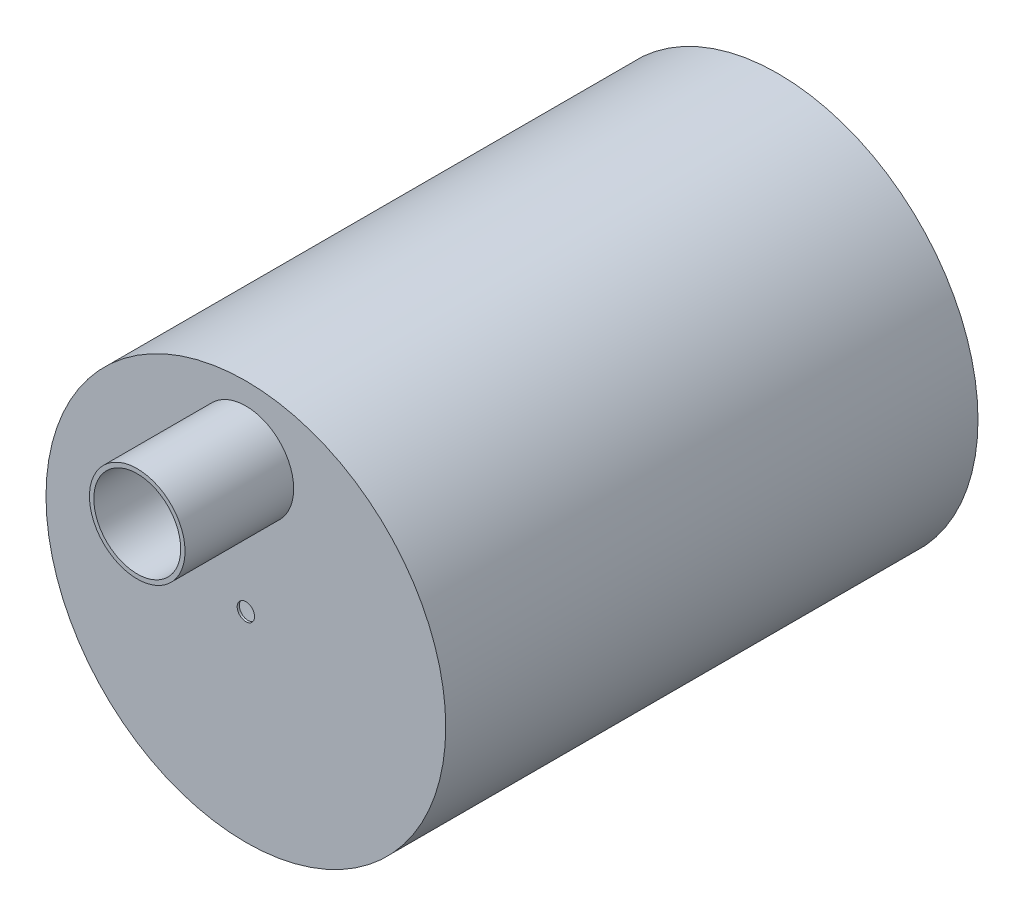
ISO-10303-21;
HEADER;
FILE_DESCRIPTION(('STEP AP214'),'2;1');
FILE_NAME('part.step','',(''),(''),'','','');
FILE_SCHEMA(('AUTOMOTIVE_DESIGN { 1 0 10303 214 1 1 1 1 }'));
ENDSEC;
DATA;
#1=APPLICATION_CONTEXT('core data for automotive mechanical design processes');
#2=APPLICATION_PROTOCOL_DEFINITION('international standard','automotive_design',2000,#1);
#3=PRODUCT_CONTEXT('',#1,'mechanical');
#4=PRODUCT('Part','Part','',(#3));
#5=PRODUCT_RELATED_PRODUCT_CATEGORY('part','',(#4));
#6=PRODUCT_DEFINITION_FORMATION('','',#4);
#7=PRODUCT_DEFINITION_CONTEXT('part definition',#1,'design');
#8=PRODUCT_DEFINITION('design','',#6,#7);
#9=PRODUCT_DEFINITION_SHAPE('','',#8);
#10=(LENGTH_UNIT() NAMED_UNIT(*) SI_UNIT(.MILLI.,.METRE.));
#11=(NAMED_UNIT(*) PLANE_ANGLE_UNIT() SI_UNIT($,.RADIAN.));
#12=(NAMED_UNIT(*) SI_UNIT($,.STERADIAN.) SOLID_ANGLE_UNIT());
#13=UNCERTAINTY_MEASURE_WITH_UNIT(LENGTH_MEASURE(1.E-05),#10,'distance_accuracy_value','');
#14=(GEOMETRIC_REPRESENTATION_CONTEXT(3) GLOBAL_UNCERTAINTY_ASSIGNED_CONTEXT((#13)) GLOBAL_UNIT_ASSIGNED_CONTEXT((#10,
#11,#12)) REPRESENTATION_CONTEXT('',''));
#15=CARTESIAN_POINT('',(0.,0.,0.));
#16=DIRECTION('',(0.,0.,1.));
#17=DIRECTION('',(1.,0.,0.));
#18=AXIS2_PLACEMENT_3D('',#15,#16,#17);
#19=CARTESIAN_POINT('',(0.,60.,295.));
#20=DIRECTION('',(0.,0.,1.));
#21=DIRECTION('',(1.,0.,0.));
#22=AXIS2_PLACEMENT_3D('',#19,#20,#21);
#23=PLANE('',#22);
#24=CARTESIAN_POINT('',(0.,60.,295.));
#25=DIRECTION('',(0.,0.,1.));
#26=DIRECTION('',(1.,0.,0.));
#27=AXIS2_PLACEMENT_3D('',#24,#25,#26);
#28=CIRCLE('',#27,22.);
#29=CARTESIAN_POINT('',(22.,60.,295.));
#30=VERTEX_POINT('',#29);
#31=EDGE_CURVE('E11',#30,#30,#28,.T.);
#32=ORIENTED_EDGE('',*,*,#31,.T.);
#33=EDGE_LOOP('',(#32));
#34=FACE_BOUND('',#33,.T.);
#35=CARTESIAN_POINT('',(0.,60.,295.));
#36=DIRECTION('',(0.,0.,1.));
#37=DIRECTION('',(1.,0.,0.));
#38=AXIS2_PLACEMENT_3D('',#35,#36,#37);
#39=CIRCLE('',#38,20.);
#40=CARTESIAN_POINT('',(20.,60.,295.));
#41=VERTEX_POINT('',#40);
#42=EDGE_CURVE('E49',#41,#41,#39,.T.);
#43=ORIENTED_EDGE('',*,*,#42,.F.);
#44=EDGE_LOOP('',(#43));
#45=FACE_BOUND('',#44,.T.);
#46=ADVANCED_FACE('F38',(#34,#45),#23,.T.);
#47=CARTESIAN_POINT('',(0.,60.,245.));
#48=DIRECTION('',(0.,0.,1.));
#49=DIRECTION('',(1.,0.,0.));
#50=AXIS2_PLACEMENT_3D('',#47,#48,#49);
#51=PLANE('',#50);
#52=CARTESIAN_POINT('',(0.,60.,245.));
#53=DIRECTION('',(0.,0.,1.));
#54=DIRECTION('',(1.,0.,0.));
#55=AXIS2_PLACEMENT_3D('',#52,#53,#54);
#56=CIRCLE('',#55,22.);
#57=CARTESIAN_POINT('',(22.,60.,245.));
#58=VERTEX_POINT('',#57);
#59=EDGE_CURVE('E42',#58,#58,#56,.T.);
#60=ORIENTED_EDGE('',*,*,#59,.F.);
#61=EDGE_LOOP('',(#60));
#62=FACE_BOUND('',#61,.T.);
#63=CARTESIAN_POINT('',(0.,60.,245.));
#64=DIRECTION('',(0.,0.,1.));
#65=DIRECTION('',(1.,0.,0.));
#66=AXIS2_PLACEMENT_3D('',#63,#64,#65);
#67=CIRCLE('',#66,20.);
#68=CARTESIAN_POINT('',(20.,60.,245.));
#69=VERTEX_POINT('',#68);
#70=EDGE_CURVE('E51',#69,#69,#67,.T.);
#71=ORIENTED_EDGE('',*,*,#70,.T.);
#72=EDGE_LOOP('',(#71));
#73=FACE_BOUND('',#72,.T.);
#74=ADVANCED_FACE('F61',(#62,#73),#51,.F.);
#75=CARTESIAN_POINT('',(0.,60.,295.));
#76=DIRECTION('',(0.,0.,-1.));
#77=DIRECTION('',(-1.,0.,0.));
#78=AXIS2_PLACEMENT_3D('',#75,#76,#77);
#79=CYLINDRICAL_SURFACE('',#78,22.);
#80=ORIENTED_EDGE('',*,*,#31,.F.);
#81=EDGE_LOOP('',(#80));
#82=FACE_BOUND('',#81,.T.);
#83=ORIENTED_EDGE('',*,*,#59,.T.);
#84=EDGE_LOOP('',(#83));
#85=FACE_BOUND('',#84,.T.);
#86=ADVANCED_FACE('F40',(#82,#85),#79,.T.);
#87=CARTESIAN_POINT('',(0.,60.,295.));
#88=DIRECTION('',(0.,0.,-1.));
#89=DIRECTION('',(-1.,0.,0.));
#90=AXIS2_PLACEMENT_3D('',#87,#88,#89);
#91=CYLINDRICAL_SURFACE('',#90,20.);
#92=ORIENTED_EDGE('',*,*,#42,.T.);
#93=EDGE_LOOP('',(#92));
#94=FACE_BOUND('',#93,.T.);
#95=ORIENTED_EDGE('',*,*,#70,.F.);
#96=EDGE_LOOP('',(#95));
#97=FACE_BOUND('',#96,.T.);
#98=ADVANCED_FACE('F57',(#94,#97),#91,.F.);
#99=CLOSED_SHELL('',(#46,#74,#86,#98));
#100=MANIFOLD_SOLID_BREP('B2',#99);
#101=CARTESIAN_POINT('',(0.,0.,245.));
#102=DIRECTION('',(0.,0.,-1.));
#103=DIRECTION('',(-1.,0.,0.));
#104=AXIS2_PLACEMENT_3D('',#101,#102,#103);
#105=CYLINDRICAL_SURFACE('',#104,90.);
#106=CARTESIAN_POINT('',(0.,0.,0.));
#107=DIRECTION('',(0.,0.,1.));
#108=DIRECTION('',(1.,0.,0.));
#109=AXIS2_PLACEMENT_3D('',#106,#107,#108);
#110=CIRCLE('',#109,90.);
#111=CARTESIAN_POINT('',(90.,0.,0.));
#112=VERTEX_POINT('',#111);
#113=EDGE_CURVE('E110',#112,#112,#110,.T.);
#114=ORIENTED_EDGE('',*,*,#113,.F.);
#115=EDGE_LOOP('',(#114));
#116=FACE_BOUND('',#115,.T.);
#117=CARTESIAN_POINT('',(0.,0.,244.));
#118=DIRECTION('',(0.,0.,1.));
#119=DIRECTION('',(1.,0.,0.));
#120=AXIS2_PLACEMENT_3D('',#117,#118,#119);
#121=CIRCLE('',#120,90.);
#122=CARTESIAN_POINT('',(90.,0.,244.));
#123=VERTEX_POINT('',#122);
#124=EDGE_CURVE('E114',#123,#123,#121,.T.);
#125=ORIENTED_EDGE('',*,*,#124,.T.);
#126=EDGE_LOOP('',(#125));
#127=FACE_BOUND('',#126,.T.);
#128=ADVANCED_FACE('F99',(#116,#127),#105,.F.);
#129=CARTESIAN_POINT('',(0.,0.,245.));
#130=DIRECTION('',(0.,0.,1.));
#131=DIRECTION('',(1.,0.,0.));
#132=AXIS2_PLACEMENT_3D('',#129,#130,#131);
#133=PLANE('',#132);
#134=CARTESIAN_POINT('',(0.,0.,245.));
#135=DIRECTION('',(0.,0.,1.));
#136=DIRECTION('',(1.,0.,0.));
#137=AXIS2_PLACEMENT_3D('',#134,#135,#136);
#138=CIRCLE('',#137,92.);
#139=CARTESIAN_POINT('',(92.,0.,245.));
#140=VERTEX_POINT('',#139);
#141=EDGE_CURVE('E37',#140,#140,#138,.T.);
#142=ORIENTED_EDGE('',*,*,#141,.T.);
#143=EDGE_LOOP('',(#142));
#144=FACE_BOUND('',#143,.T.);
#145=CARTESIAN_POINT('',(0.,60.,245.));
#146=DIRECTION('',(0.,0.,1.));
#147=DIRECTION('',(1.,0.,0.));
#148=AXIS2_PLACEMENT_3D('',#145,#146,#147);
#149=CIRCLE('',#148,20.);
#150=CARTESIAN_POINT('',(20.,60.,245.));
#151=VERTEX_POINT('',#150);
#152=EDGE_CURVE('E124',#151,#151,#149,.T.);
#153=ORIENTED_EDGE('',*,*,#152,.F.);
#154=EDGE_LOOP('',(#153));
#155=FACE_BOUND('',#154,.T.);
#156=CARTESIAN_POINT('',(0.,0.,245.));
#157=DIRECTION('',(0.,0.,1.));
#158=DIRECTION('',(1.,0.,0.));
#159=AXIS2_PLACEMENT_3D('',#156,#157,#158);
#160=CIRCLE('',#159,4.);
#161=CARTESIAN_POINT('',(4.,0.,245.));
#162=VERTEX_POINT('',#161);
#163=EDGE_CURVE('E118',#162,#162,#160,.T.);
#164=ORIENTED_EDGE('',*,*,#163,.F.);
#165=EDGE_LOOP('',(#164));
#166=FACE_BOUND('',#165,.T.);
#167=ADVANCED_FACE('F140',(#144,#155,#166),#133,.T.);
#168=CARTESIAN_POINT('',(0.,0.,0.));
#169=DIRECTION('',(0.,0.,1.));
#170=DIRECTION('',(1.,0.,0.));
#171=AXIS2_PLACEMENT_3D('',#168,#169,#170);
#172=PLANE('',#171);
#173=CARTESIAN_POINT('',(0.,0.,0.));
#174=DIRECTION('',(0.,0.,1.));
#175=DIRECTION('',(1.,0.,0.));
#176=AXIS2_PLACEMENT_3D('',#173,#174,#175);
#177=CIRCLE('',#176,92.);
#178=CARTESIAN_POINT('',(92.,0.,0.));
#179=VERTEX_POINT('',#178);
#180=EDGE_CURVE('E103',#179,#179,#177,.T.);
#181=ORIENTED_EDGE('',*,*,#180,.F.);
#182=EDGE_LOOP('',(#181));
#183=FACE_BOUND('',#182,.T.);
#184=ORIENTED_EDGE('',*,*,#113,.T.);
#185=EDGE_LOOP('',(#184));
#186=FACE_BOUND('',#185,.T.);
#187=ADVANCED_FACE('F143',(#183,#186),#172,.F.);
#188=CARTESIAN_POINT('',(0.,0.,245.));
#189=DIRECTION('',(0.,0.,-1.));
#190=DIRECTION('',(-1.,0.,0.));
#191=AXIS2_PLACEMENT_3D('',#188,#189,#190);
#192=CYLINDRICAL_SURFACE('',#191,92.);
#193=ORIENTED_EDGE('',*,*,#141,.F.);
#194=EDGE_LOOP('',(#193));
#195=FACE_BOUND('',#194,.T.);
#196=ORIENTED_EDGE('',*,*,#180,.T.);
#197=EDGE_LOOP('',(#196));
#198=FACE_BOUND('',#197,.T.);
#199=ADVANCED_FACE('F101',(#195,#198),#192,.T.);
#200=CARTESIAN_POINT('',(0.,0.,244.));
#201=DIRECTION('',(0.,0.,1.));
#202=DIRECTION('',(1.,0.,0.));
#203=AXIS2_PLACEMENT_3D('',#200,#201,#202);
#204=PLANE('',#203);
#205=CARTESIAN_POINT('',(0.,60.,244.));
#206=DIRECTION('',(0.,0.,1.));
#207=DIRECTION('',(1.,0.,0.));
#208=AXIS2_PLACEMENT_3D('',#205,#206,#207);
#209=CIRCLE('',#208,20.);
#210=CARTESIAN_POINT('',(20.,60.,244.));
#211=VERTEX_POINT('',#210);
#212=EDGE_CURVE('E121',#211,#211,#209,.T.);
#213=ORIENTED_EDGE('',*,*,#212,.T.);
#214=EDGE_LOOP('',(#213));
#215=FACE_BOUND('',#214,.T.);
#216=CARTESIAN_POINT('',(0.,0.,244.));
#217=DIRECTION('',(0.,0.,1.));
#218=DIRECTION('',(1.,0.,0.));
#219=AXIS2_PLACEMENT_3D('',#216,#217,#218);
#220=CIRCLE('',#219,4.);
#221=CARTESIAN_POINT('',(4.,0.,244.));
#222=VERTEX_POINT('',#221);
#223=EDGE_CURVE('E117',#222,#222,#220,.T.);
#224=ORIENTED_EDGE('',*,*,#223,.T.);
#225=EDGE_LOOP('',(#224));
#226=FACE_BOUND('',#225,.T.);
#227=ORIENTED_EDGE('',*,*,#124,.F.);
#228=EDGE_LOOP('',(#227));
#229=FACE_BOUND('',#228,.T.);
#230=ADVANCED_FACE('F130',(#215,#226,#229),#204,.F.);
#231=CARTESIAN_POINT('',(0.,0.,244.));
#232=DIRECTION('',(0.,0.,1.));
#233=DIRECTION('',(1.,0.,0.));
#234=AXIS2_PLACEMENT_3D('',#231,#232,#233);
#235=CYLINDRICAL_SURFACE('',#234,4.);
#236=ORIENTED_EDGE('',*,*,#223,.F.);
#237=EDGE_LOOP('',(#236));
#238=FACE_BOUND('',#237,.T.);
#239=ORIENTED_EDGE('',*,*,#163,.T.);
#240=EDGE_LOOP('',(#239));
#241=FACE_BOUND('',#240,.T.);
#242=ADVANCED_FACE('F136',(#238,#241),#235,.F.);
#243=CARTESIAN_POINT('',(0.,60.,244.));
#244=DIRECTION('',(0.,0.,1.));
#245=DIRECTION('',(1.,0.,0.));
#246=AXIS2_PLACEMENT_3D('',#243,#244,#245);
#247=CYLINDRICAL_SURFACE('',#246,20.);
#248=ORIENTED_EDGE('',*,*,#212,.F.);
#249=EDGE_LOOP('',(#248));
#250=FACE_BOUND('',#249,.T.);
#251=ORIENTED_EDGE('',*,*,#152,.T.);
#252=EDGE_LOOP('',(#251));
#253=FACE_BOUND('',#252,.T.);
#254=ADVANCED_FACE('F133',(#250,#253),#247,.F.);
#255=CLOSED_SHELL('',(#128,#167,#187,#199,#230,#242,#254));
#256=MANIFOLD_SOLID_BREP('B6',#255);
#257=ADVANCED_BREP_SHAPE_REPRESENTATION('',(#18,#100,#256),#14);
#258=SHAPE_DEFINITION_REPRESENTATION(#9,#257);
ENDSEC;
END-ISO-10303-21;
